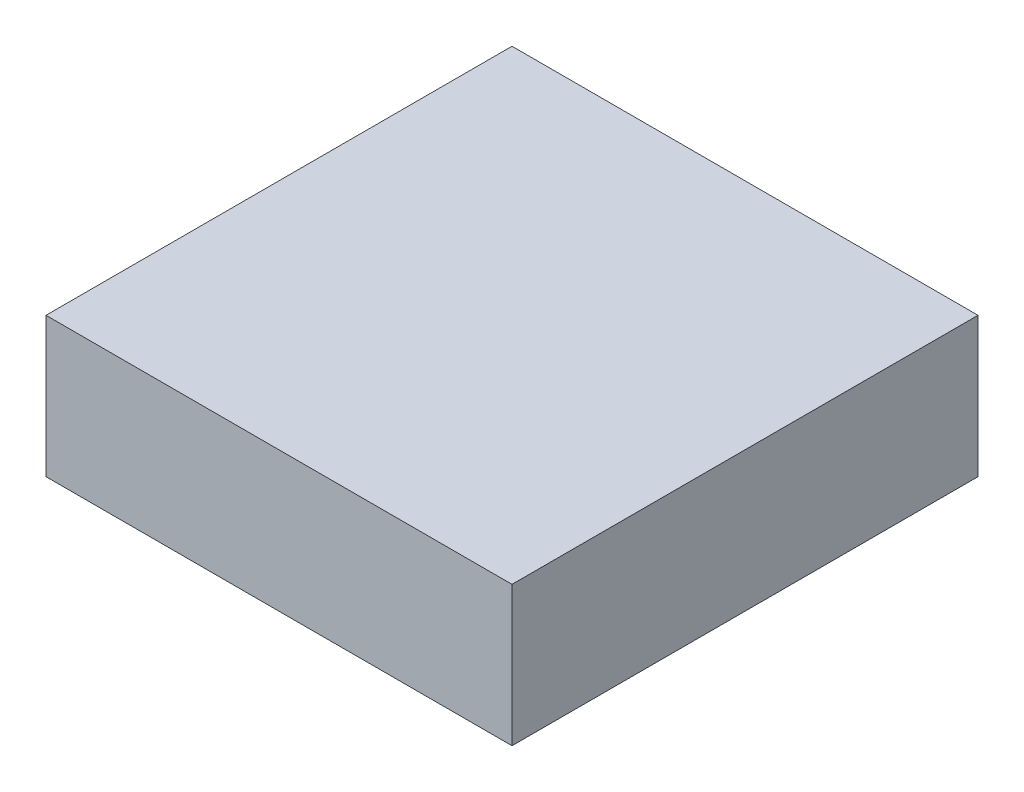
ISO-10303-21;
HEADER;
FILE_DESCRIPTION(('STEP AP214'),'2;1');
FILE_NAME('part.step','',(''),(''),'','','');
FILE_SCHEMA(('AUTOMOTIVE_DESIGN { 1 0 10303 214 1 1 1 1 }'));
ENDSEC;
DATA;
#1=APPLICATION_CONTEXT('core data for automotive mechanical design processes');
#2=APPLICATION_PROTOCOL_DEFINITION('international standard','automotive_design',2000,#1);
#3=PRODUCT_CONTEXT('',#1,'mechanical');
#4=PRODUCT('Part','Part','',(#3));
#5=PRODUCT_RELATED_PRODUCT_CATEGORY('part','',(#4));
#6=PRODUCT_DEFINITION_FORMATION('','',#4);
#7=PRODUCT_DEFINITION_CONTEXT('part definition',#1,'design');
#8=PRODUCT_DEFINITION('design','',#6,#7);
#9=PRODUCT_DEFINITION_SHAPE('','',#8);
#10=(LENGTH_UNIT() NAMED_UNIT(*) SI_UNIT(.MILLI.,.METRE.));
#11=(NAMED_UNIT(*) PLANE_ANGLE_UNIT() SI_UNIT($,.RADIAN.));
#12=(NAMED_UNIT(*) SI_UNIT($,.STERADIAN.) SOLID_ANGLE_UNIT());
#13=UNCERTAINTY_MEASURE_WITH_UNIT(LENGTH_MEASURE(1.E-05),#10,'distance_accuracy_value','');
#14=(GEOMETRIC_REPRESENTATION_CONTEXT(3) GLOBAL_UNCERTAINTY_ASSIGNED_CONTEXT((#13)) GLOBAL_UNIT_ASSIGNED_CONTEXT((#10,
#11,#12)) REPRESENTATION_CONTEXT('',''));
#15=CARTESIAN_POINT('',(0.,0.,0.));
#16=DIRECTION('',(0.,0.,1.));
#17=DIRECTION('',(1.,0.,0.));
#18=AXIS2_PLACEMENT_3D('',#15,#16,#17);
#19=CARTESIAN_POINT('',(-184.74731479013,6.,-92.6851012564696));
#20=DIRECTION('',(1.,0.,0.));
#21=DIRECTION('',(0.,0.,-1.));
#22=AXIS2_PLACEMENT_3D('',#19,#20,#21);
#23=PLANE('',#22);
#24=DIRECTION('',(0.,0.,1.));
#25=VECTOR('',#24,1.);
#26=CARTESIAN_POINT('',(-184.74731479013,0.,-92.6851012564696));
#27=LINE('',#26,#25);
#28=CARTESIAN_POINT('',(-184.74731479013,0.,-92.6851012564696));
#29=VERTEX_POINT('',#28);
#30=CARTESIAN_POINT('',(-184.74731479013,0.,-72.6851012564696));
#31=VERTEX_POINT('',#30);
#32=EDGE_CURVE('E104',#29,#31,#27,.T.);
#33=ORIENTED_EDGE('',*,*,#32,.T.);
#34=DIRECTION('',(0.,-1.,0.));
#35=VECTOR('',#34,1.);
#36=CARTESIAN_POINT('',(-184.74731479013,6.,-72.6851012564696));
#37=LINE('',#36,#35);
#38=CARTESIAN_POINT('',(-184.74731479013,6.,-72.6851012564696));
#39=VERTEX_POINT('',#38);
#40=EDGE_CURVE('E11',#39,#31,#37,.T.);
#41=ORIENTED_EDGE('',*,*,#40,.F.);
#42=DIRECTION('',(0.,0.,1.));
#43=VECTOR('',#42,1.);
#44=CARTESIAN_POINT('',(-184.74731479013,6.,-92.6851012564696));
#45=LINE('',#44,#43);
#46=CARTESIAN_POINT('',(-184.74731479013,6.,-92.6851012564696));
#47=VERTEX_POINT('',#46);
#48=EDGE_CURVE('E92',#47,#39,#45,.T.);
#49=ORIENTED_EDGE('',*,*,#48,.F.);
#50=DIRECTION('',(0.,-1.,0.));
#51=VECTOR('',#50,1.);
#52=CARTESIAN_POINT('',(-184.74731479013,6.,-92.6851012564696));
#53=LINE('',#52,#51);
#54=EDGE_CURVE('E100',#47,#29,#53,.T.);
#55=ORIENTED_EDGE('',*,*,#54,.T.);
#56=EDGE_LOOP('',(#33,#41,#49,#55));
#57=FACE_BOUND('',#56,.T.);
#58=ADVANCED_FACE('F41',(#57),#23,.F.);
#59=CARTESIAN_POINT('',(-184.74731479013,6.,-72.6851012564696));
#60=DIRECTION('',(0.,0.,-1.));
#61=DIRECTION('',(-1.,0.,0.));
#62=AXIS2_PLACEMENT_3D('',#59,#60,#61);
#63=PLANE('',#62);
#64=DIRECTION('',(1.,0.,0.));
#65=VECTOR('',#64,1.);
#66=CARTESIAN_POINT('',(-184.74731479013,0.,-72.6851012564696));
#67=LINE('',#66,#65);
#68=CARTESIAN_POINT('',(-164.74731479013,0.,-72.6851012564696));
#69=VERTEX_POINT('',#68);
#70=EDGE_CURVE('E96',#31,#69,#67,.T.);
#71=ORIENTED_EDGE('',*,*,#70,.T.);
#72=DIRECTION('',(0.,-1.,0.));
#73=VECTOR('',#72,1.);
#74=CARTESIAN_POINT('',(-164.74731479013,6.,-72.6851012564696));
#75=LINE('',#74,#73);
#76=CARTESIAN_POINT('',(-164.74731479013,6.,-72.6851012564696));
#77=VERTEX_POINT('',#76);
#78=EDGE_CURVE('E49',#77,#69,#75,.T.);
#79=ORIENTED_EDGE('',*,*,#78,.F.);
#80=DIRECTION('',(1.,0.,0.));
#81=VECTOR('',#80,1.);
#82=CARTESIAN_POINT('',(-184.74731479013,6.,-72.6851012564696));
#83=LINE('',#82,#81);
#84=EDGE_CURVE('E87',#39,#77,#83,.T.);
#85=ORIENTED_EDGE('',*,*,#84,.F.);
#86=ORIENTED_EDGE('',*,*,#40,.T.);
#87=EDGE_LOOP('',(#71,#79,#85,#86));
#88=FACE_BOUND('',#87,.T.);
#89=ADVANCED_FACE('F95',(#88),#63,.F.);
#90=CARTESIAN_POINT('',(-164.74731479013,6.,-92.6851012564696));
#91=DIRECTION('',(-1.,0.,0.));
#92=DIRECTION('',(0.,0.,1.));
#93=AXIS2_PLACEMENT_3D('',#90,#91,#92);
#94=PLANE('',#93);
#95=DIRECTION('',(0.,0.,-1.));
#96=VECTOR('',#95,1.);
#97=CARTESIAN_POINT('',(-164.74731479013,0.,-92.6851012564696));
#98=LINE('',#97,#96);
#99=CARTESIAN_POINT('',(-164.74731479013,0.,-92.6851012564696));
#100=VERTEX_POINT('',#99);
#101=EDGE_CURVE('E74',#69,#100,#98,.T.);
#102=ORIENTED_EDGE('',*,*,#101,.T.);
#103=DIRECTION('',(0.,-1.,0.));
#104=VECTOR('',#103,1.);
#105=CARTESIAN_POINT('',(-164.74731479013,6.,-92.6851012564696));
#106=LINE('',#105,#104);
#107=CARTESIAN_POINT('',(-164.74731479013,6.,-92.6851012564696));
#108=VERTEX_POINT('',#107);
#109=EDGE_CURVE('E97',#108,#100,#106,.T.);
#110=ORIENTED_EDGE('',*,*,#109,.F.);
#111=DIRECTION('',(0.,0.,-1.));
#112=VECTOR('',#111,1.);
#113=CARTESIAN_POINT('',(-164.74731479013,6.,-92.6851012564696));
#114=LINE('',#113,#112);
#115=EDGE_CURVE('E90',#77,#108,#114,.T.);
#116=ORIENTED_EDGE('',*,*,#115,.F.);
#117=ORIENTED_EDGE('',*,*,#78,.T.);
#118=EDGE_LOOP('',(#102,#110,#116,#117));
#119=FACE_BOUND('',#118,.T.);
#120=ADVANCED_FACE('F98',(#119),#94,.F.);
#121=CARTESIAN_POINT('',(-184.74731479013,6.,-92.6851012564696));
#122=DIRECTION('',(0.,0.,1.));
#123=DIRECTION('',(1.,0.,0.));
#124=AXIS2_PLACEMENT_3D('',#121,#122,#123);
#125=PLANE('',#124);
#126=DIRECTION('',(-1.,0.,0.));
#127=VECTOR('',#126,1.);
#128=CARTESIAN_POINT('',(-184.74731479013,0.,-92.6851012564696));
#129=LINE('',#128,#127);
#130=EDGE_CURVE('E80',#100,#29,#129,.T.);
#131=ORIENTED_EDGE('',*,*,#130,.T.);
#132=ORIENTED_EDGE('',*,*,#54,.F.);
#133=DIRECTION('',(-1.,0.,0.));
#134=VECTOR('',#133,1.);
#135=CARTESIAN_POINT('',(-184.74731479013,6.,-92.6851012564696));
#136=LINE('',#135,#134);
#137=EDGE_CURVE('E57',#108,#47,#136,.T.);
#138=ORIENTED_EDGE('',*,*,#137,.F.);
#139=ORIENTED_EDGE('',*,*,#109,.T.);
#140=EDGE_LOOP('',(#131,#132,#138,#139));
#141=FACE_BOUND('',#140,.T.);
#142=ADVANCED_FACE('F111',(#141),#125,.F.);
#143=CARTESIAN_POINT('',(0.,6.,0.));
#144=DIRECTION('',(0.,1.,0.));
#145=DIRECTION('',(0.,0.,1.));
#146=AXIS2_PLACEMENT_3D('',#143,#144,#145);
#147=PLANE('',#146);
#148=ORIENTED_EDGE('',*,*,#48,.T.);
#149=ORIENTED_EDGE('',*,*,#84,.T.);
#150=ORIENTED_EDGE('',*,*,#115,.T.);
#151=ORIENTED_EDGE('',*,*,#137,.T.);
#152=EDGE_LOOP('',(#148,#149,#150,#151));
#153=FACE_BOUND('',#152,.T.);
#154=ADVANCED_FACE('F88',(#153),#147,.T.);
#155=CARTESIAN_POINT('',(0.,0.,0.));
#156=DIRECTION('',(0.,1.,0.));
#157=DIRECTION('',(0.,0.,1.));
#158=AXIS2_PLACEMENT_3D('',#155,#156,#157);
#159=PLANE('',#158);
#160=ORIENTED_EDGE('',*,*,#32,.F.);
#161=ORIENTED_EDGE('',*,*,#130,.F.);
#162=ORIENTED_EDGE('',*,*,#101,.F.);
#163=ORIENTED_EDGE('',*,*,#70,.F.);
#164=EDGE_LOOP('',(#160,#161,#162,#163));
#165=FACE_BOUND('',#164,.T.);
#166=ADVANCED_FACE('F114',(#165),#159,.F.);
#167=CLOSED_SHELL('',(#58,#89,#120,#142,#154,#166));
#168=MANIFOLD_SOLID_BREP('B2',#167);
#169=ADVANCED_BREP_SHAPE_REPRESENTATION('',(#18,#168),#14);
#170=SHAPE_DEFINITION_REPRESENTATION(#9,#169);
ENDSEC;
END-ISO-10303-21;
